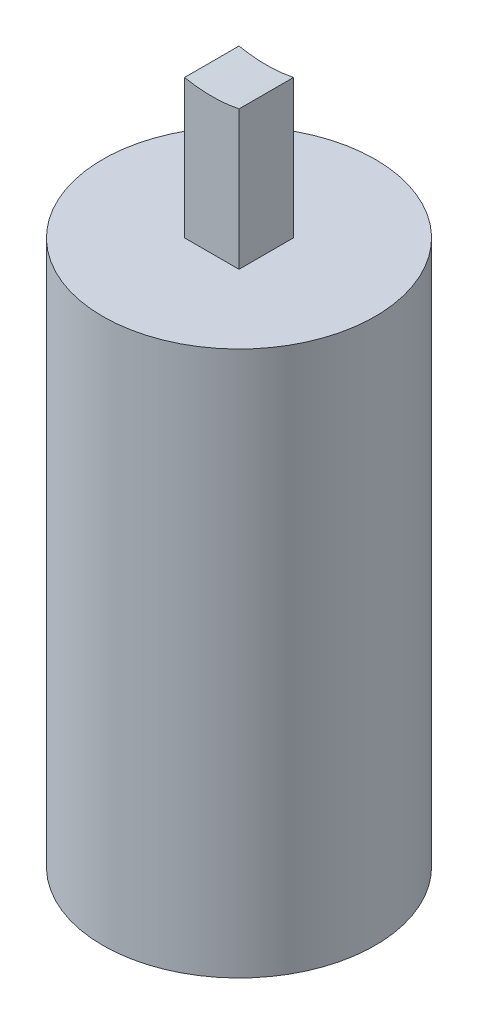
ISO-10303-21;
HEADER;
FILE_DESCRIPTION(('STEP AP214'),'2;1');
FILE_NAME('part.step','',(''),(''),'','','');
FILE_SCHEMA(('AUTOMOTIVE_DESIGN { 1 0 10303 214 1 1 1 1 }'));
ENDSEC;
DATA;
#1=APPLICATION_CONTEXT('core data for automotive mechanical design processes');
#2=APPLICATION_PROTOCOL_DEFINITION('international standard','automotive_design',2000,#1);
#3=PRODUCT_CONTEXT('',#1,'mechanical');
#4=PRODUCT('Part','Part','',(#3));
#5=PRODUCT_RELATED_PRODUCT_CATEGORY('part','',(#4));
#6=PRODUCT_DEFINITION_FORMATION('','',#4);
#7=PRODUCT_DEFINITION_CONTEXT('part definition',#1,'design');
#8=PRODUCT_DEFINITION('design','',#6,#7);
#9=PRODUCT_DEFINITION_SHAPE('','',#8);
#10=(LENGTH_UNIT() NAMED_UNIT(*) SI_UNIT(.MILLI.,.METRE.));
#11=(NAMED_UNIT(*) PLANE_ANGLE_UNIT() SI_UNIT($,.RADIAN.));
#12=(NAMED_UNIT(*) SI_UNIT($,.STERADIAN.) SOLID_ANGLE_UNIT());
#13=UNCERTAINTY_MEASURE_WITH_UNIT(LENGTH_MEASURE(1.E-05),#10,'distance_accuracy_value','');
#14=(GEOMETRIC_REPRESENTATION_CONTEXT(3) GLOBAL_UNCERTAINTY_ASSIGNED_CONTEXT((#13)) GLOBAL_UNIT_ASSIGNED_CONTEXT((#10,
#11,#12)) REPRESENTATION_CONTEXT('',''));
#15=CARTESIAN_POINT('',(0.,0.,0.));
#16=DIRECTION('',(0.,0.,1.));
#17=DIRECTION('',(1.,0.,0.));
#18=AXIS2_PLACEMENT_3D('',#15,#16,#17);
#19=CARTESIAN_POINT('',(0.,20.,0.));
#20=DIRECTION('',(0.,-1.,0.));
#21=DIRECTION('',(0.,0.,-1.));
#22=AXIS2_PLACEMENT_3D('',#19,#20,#21);
#23=CYLINDRICAL_SURFACE('',#22,5.);
#24=CARTESIAN_POINT('',(0.,20.,0.));
#25=DIRECTION('',(0.,1.,0.));
#26=DIRECTION('',(0.,0.,1.));
#27=AXIS2_PLACEMENT_3D('',#24,#25,#26);
#28=CIRCLE('',#27,5.);
#29=CARTESIAN_POINT('',(0.,20.,5.));
#30=VERTEX_POINT('',#29);
#31=EDGE_CURVE('E11',#30,#30,#28,.T.);
#32=ORIENTED_EDGE('',*,*,#31,.F.);
#33=EDGE_LOOP('',(#32));
#34=FACE_BOUND('',#33,.T.);
#35=CARTESIAN_POINT('',(0.,0.,0.));
#36=DIRECTION('',(0.,1.,0.));
#37=DIRECTION('',(0.,0.,1.));
#38=AXIS2_PLACEMENT_3D('',#35,#36,#37);
#39=CIRCLE('',#38,5.);
#40=CARTESIAN_POINT('',(0.,0.,5.));
#41=VERTEX_POINT('',#40);
#42=EDGE_CURVE('E36',#41,#41,#39,.T.);
#43=ORIENTED_EDGE('',*,*,#42,.T.);
#44=EDGE_LOOP('',(#43));
#45=FACE_BOUND('',#44,.T.);
#46=ADVANCED_FACE('F33',(#34,#45),#23,.T.);
#47=CARTESIAN_POINT('',(0.,20.,0.));
#48=DIRECTION('',(0.,1.,0.));
#49=DIRECTION('',(0.,0.,1.));
#50=AXIS2_PLACEMENT_3D('',#47,#48,#49);
#51=PLANE('',#50);
#52=DIRECTION('',(0.,0.,-1.));
#53=VECTOR('',#52,1.);
#54=CARTESIAN_POINT('',(1.,20.,-1.));
#55=LINE('',#54,#53);
#56=CARTESIAN_POINT('',(1.,20.,1.));
#57=VERTEX_POINT('',#56);
#58=CARTESIAN_POINT('',(1.,20.,-1.));
#59=VERTEX_POINT('',#58);
#60=EDGE_CURVE('E82',#57,#59,#55,.T.);
#61=ORIENTED_EDGE('',*,*,#60,.F.);
#62=DIRECTION('',(1.,0.,0.));
#63=VECTOR('',#62,1.);
#64=CARTESIAN_POINT('',(-1.,20.,1.));
#65=LINE('',#64,#63);
#66=CARTESIAN_POINT('',(-1.,20.,1.));
#67=VERTEX_POINT('',#66);
#68=EDGE_CURVE('E88',#67,#57,#65,.T.);
#69=ORIENTED_EDGE('',*,*,#68,.F.);
#70=DIRECTION('',(0.,0.,1.));
#71=VECTOR('',#70,1.);
#72=CARTESIAN_POINT('',(-1.,20.,-1.));
#73=LINE('',#72,#71);
#74=CARTESIAN_POINT('',(-1.,20.,-1.));
#75=VERTEX_POINT('',#74);
#76=EDGE_CURVE('E93',#75,#67,#73,.T.);
#77=ORIENTED_EDGE('',*,*,#76,.F.);
#78=DIRECTION('',(-1.,0.,0.));
#79=VECTOR('',#78,1.);
#80=CARTESIAN_POINT('',(-1.,20.,-1.));
#81=LINE('',#80,#79);
#82=EDGE_CURVE('E175',#59,#75,#81,.T.);
#83=ORIENTED_EDGE('',*,*,#82,.F.);
#84=EDGE_LOOP('',(#61,#69,#77,#83));
#85=FACE_BOUND('',#84,.T.);
#86=ORIENTED_EDGE('',*,*,#31,.T.);
#87=EDGE_LOOP('',(#86));
#88=FACE_BOUND('',#87,.T.);
#89=ADVANCED_FACE('F107',(#85,#88),#51,.T.);
#90=CARTESIAN_POINT('',(0.,0.,0.));
#91=DIRECTION('',(0.,1.,0.));
#92=DIRECTION('',(0.,0.,1.));
#93=AXIS2_PLACEMENT_3D('',#90,#91,#92);
#94=PLANE('',#93);
#95=ORIENTED_EDGE('',*,*,#42,.F.);
#96=EDGE_LOOP('',(#95));
#97=FACE_BOUND('',#96,.T.);
#98=ADVANCED_FACE('F105',(#97),#94,.F.);
#99=CARTESIAN_POINT('',(1.,30.,-1.));
#100=DIRECTION('',(-1.,0.,0.));
#101=DIRECTION('',(0.,0.,1.));
#102=AXIS2_PLACEMENT_3D('',#99,#100,#101);
#103=PLANE('',#102);
#104=DIRECTION('',(0.,-1.,0.));
#105=VECTOR('',#104,1.);
#106=CARTESIAN_POINT('',(1.,30.,-1.));
#107=LINE('',#106,#105);
#108=CARTESIAN_POINT('',(1.,25.1010205144336,-1.));
#109=VERTEX_POINT('',#108);
#110=EDGE_CURVE('E81',#109,#59,#107,.T.);
#111=ORIENTED_EDGE('',*,*,#110,.F.);
#112=DIRECTION('',(0.,0.,1.));
#113=VECTOR('',#112,1.);
#114=CARTESIAN_POINT('',(0.999999999999999,25.1010205144336,-5.));
#115=LINE('',#114,#113);
#116=CARTESIAN_POINT('',(1.,25.1010205144336,1.));
#117=VERTEX_POINT('',#116);
#118=EDGE_CURVE('E74',#109,#117,#115,.T.);
#119=ORIENTED_EDGE('',*,*,#118,.T.);
#120=DIRECTION('',(0.,-1.,0.));
#121=VECTOR('',#120,1.);
#122=CARTESIAN_POINT('',(1.,30.,1.));
#123=LINE('',#122,#121);
#124=EDGE_CURVE('E55',#117,#57,#123,.T.);
#125=ORIENTED_EDGE('',*,*,#124,.T.);
#126=ORIENTED_EDGE('',*,*,#60,.T.);
#127=EDGE_LOOP('',(#111,#119,#125,#126));
#128=FACE_BOUND('',#127,.T.);
#129=ADVANCED_FACE('F80',(#128),#103,.F.);
#130=CARTESIAN_POINT('',(-1.,30.,-1.));
#131=DIRECTION('',(0.,0.,1.));
#132=DIRECTION('',(1.,0.,0.));
#133=AXIS2_PLACEMENT_3D('',#130,#131,#132);
#134=PLANE('',#133);
#135=DIRECTION('',(0.,-1.,0.));
#136=VECTOR('',#135,1.);
#137=CARTESIAN_POINT('',(-1.,30.,-1.));
#138=LINE('',#137,#136);
#139=CARTESIAN_POINT('',(-1.,25.1010205144336,-1.));
#140=VERTEX_POINT('',#139);
#141=EDGE_CURVE('E91',#140,#75,#138,.T.);
#142=ORIENTED_EDGE('',*,*,#141,.F.);
#143=CARTESIAN_POINT('',(0.,30.,-1.));
#144=DIRECTION('',(0.,0.,1.));
#145=DIRECTION('',(1.,0.,0.));
#146=AXIS2_PLACEMENT_3D('',#143,#144,#145);
#147=CIRCLE('',#146,5.);
#148=EDGE_CURVE('E83',#140,#109,#147,.T.);
#149=ORIENTED_EDGE('',*,*,#148,.T.);
#150=ORIENTED_EDGE('',*,*,#110,.T.);
#151=ORIENTED_EDGE('',*,*,#82,.T.);
#152=EDGE_LOOP('',(#142,#149,#150,#151));
#153=FACE_BOUND('',#152,.T.);
#154=ADVANCED_FACE('F112',(#153),#134,.F.);
#155=CARTESIAN_POINT('',(-1.,30.,-1.));
#156=DIRECTION('',(1.,0.,0.));
#157=DIRECTION('',(0.,0.,-1.));
#158=AXIS2_PLACEMENT_3D('',#155,#156,#157);
#159=PLANE('',#158);
#160=DIRECTION('',(0.,-1.,0.));
#161=VECTOR('',#160,1.);
#162=CARTESIAN_POINT('',(-1.,30.,1.));
#163=LINE('',#162,#161);
#164=CARTESIAN_POINT('',(-1.,25.1010205144336,1.));
#165=VERTEX_POINT('',#164);
#166=EDGE_CURVE('E89',#165,#67,#163,.T.);
#167=ORIENTED_EDGE('',*,*,#166,.F.);
#168=DIRECTION('',(0.,0.,1.));
#169=VECTOR('',#168,1.);
#170=CARTESIAN_POINT('',(-1.,25.1010205144336,-5.));
#171=LINE('',#170,#169);
#172=EDGE_CURVE('E47',#165,#140,#171,.F.);
#173=ORIENTED_EDGE('',*,*,#172,.T.);
#174=ORIENTED_EDGE('',*,*,#141,.T.);
#175=ORIENTED_EDGE('',*,*,#76,.T.);
#176=EDGE_LOOP('',(#167,#173,#174,#175));
#177=FACE_BOUND('',#176,.T.);
#178=ADVANCED_FACE('F143',(#177),#159,.F.);
#179=CARTESIAN_POINT('',(-1.,30.,1.));
#180=DIRECTION('',(0.,0.,-1.));
#181=DIRECTION('',(-1.,0.,0.));
#182=AXIS2_PLACEMENT_3D('',#179,#180,#181);
#183=PLANE('',#182);
#184=ORIENTED_EDGE('',*,*,#124,.F.);
#185=CARTESIAN_POINT('',(0.,30.,1.));
#186=DIRECTION('',(0.,0.,1.));
#187=DIRECTION('',(1.,0.,0.));
#188=AXIS2_PLACEMENT_3D('',#185,#186,#187);
#189=CIRCLE('',#188,5.);
#190=EDGE_CURVE('E72',#165,#117,#189,.T.);
#191=ORIENTED_EDGE('',*,*,#190,.F.);
#192=ORIENTED_EDGE('',*,*,#166,.T.);
#193=ORIENTED_EDGE('',*,*,#68,.T.);
#194=EDGE_LOOP('',(#184,#191,#192,#193));
#195=FACE_BOUND('',#194,.T.);
#196=ADVANCED_FACE('F86',(#195),#183,.F.);
#197=CARTESIAN_POINT('',(0.,30.,-5.));
#198=DIRECTION('',(0.,0.,1.));
#199=DIRECTION('',(1.,0.,0.));
#200=AXIS2_PLACEMENT_3D('',#197,#198,#199);
#201=CYLINDRICAL_SURFACE('',#200,5.);
#202=ORIENTED_EDGE('',*,*,#148,.F.);
#203=ORIENTED_EDGE('',*,*,#172,.F.);
#204=ORIENTED_EDGE('',*,*,#190,.T.);
#205=ORIENTED_EDGE('',*,*,#118,.F.);
#206=EDGE_LOOP('',(#202,#203,#204,#205));
#207=FACE_BOUND('',#206,.T.);
#208=ADVANCED_FACE('F73',(#207),#201,.F.);
#209=CLOSED_SHELL('',(#46,#89,#98,#129,#154,#178,#196,#208));
#210=MANIFOLD_SOLID_BREP('B2',#209);
#211=ADVANCED_BREP_SHAPE_REPRESENTATION('',(#18,#210),#14);
#212=SHAPE_DEFINITION_REPRESENTATION(#9,#211);
ENDSEC;
END-ISO-10303-21;
